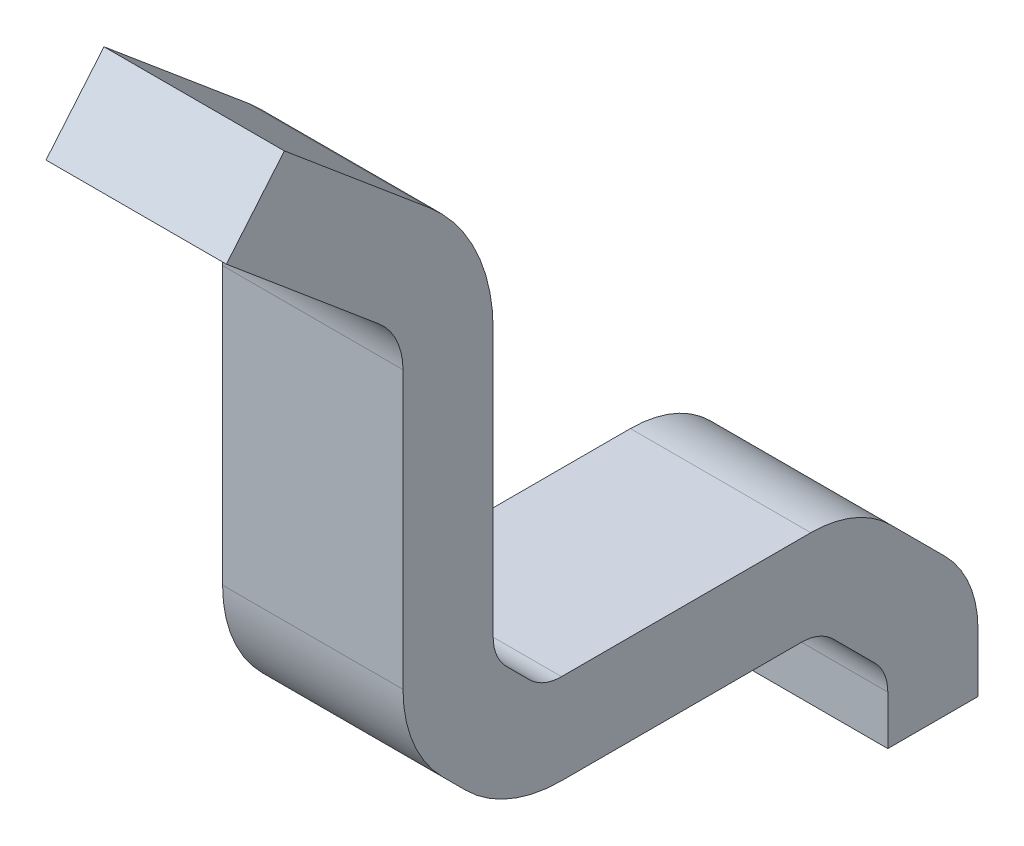
ISO-10303-21;
HEADER;
FILE_DESCRIPTION(('STEP AP214'),'2;1');
FILE_NAME('part.step','',(''),(''),'','','');
FILE_SCHEMA(('AUTOMOTIVE_DESIGN { 1 0 10303 214 1 1 1 1 }'));
ENDSEC;
DATA;
#1=APPLICATION_CONTEXT('core data for automotive mechanical design processes');
#2=APPLICATION_PROTOCOL_DEFINITION('international standard','automotive_design',2000,#1);
#3=PRODUCT_CONTEXT('',#1,'mechanical');
#4=PRODUCT('Part','Part','',(#3));
#5=PRODUCT_RELATED_PRODUCT_CATEGORY('part','',(#4));
#6=PRODUCT_DEFINITION_FORMATION('','',#4);
#7=PRODUCT_DEFINITION_CONTEXT('part definition',#1,'design');
#8=PRODUCT_DEFINITION('design','',#6,#7);
#9=PRODUCT_DEFINITION_SHAPE('','',#8);
#10=(LENGTH_UNIT() NAMED_UNIT(*) SI_UNIT(.MILLI.,.METRE.));
#11=(NAMED_UNIT(*) PLANE_ANGLE_UNIT() SI_UNIT($,.RADIAN.));
#12=(NAMED_UNIT(*) SI_UNIT($,.STERADIAN.) SOLID_ANGLE_UNIT());
#13=UNCERTAINTY_MEASURE_WITH_UNIT(LENGTH_MEASURE(1.E-05),#10,'distance_accuracy_value','');
#14=(GEOMETRIC_REPRESENTATION_CONTEXT(3) GLOBAL_UNCERTAINTY_ASSIGNED_CONTEXT((#13)) GLOBAL_UNIT_ASSIGNED_CONTEXT((#10,
#11,#12)) REPRESENTATION_CONTEXT('',''));
#15=CARTESIAN_POINT('',(0.,0.,0.));
#16=DIRECTION('',(0.,0.,1.));
#17=DIRECTION('',(1.,0.,0.));
#18=AXIS2_PLACEMENT_3D('',#15,#16,#17);
#19=CARTESIAN_POINT('',(0.,-39.82481453965,-663.1));
#20=DIRECTION('',(0.,0.707106781186598,-0.707106781186498));
#21=DIRECTION('',(0.,0.707106781186498,0.707106781186598));
#22=AXIS2_PLACEMENT_3D('',#19,#20,#21);
#23=PLANE('',#22);
#24=DIRECTION('',(0.,0.707106781186498,0.707106781186598));
#25=VECTOR('',#24,1.);
#26=CARTESIAN_POINT('',(-4.,-39.82481453965,-663.1));
#27=LINE('',#26,#25);
#28=CARTESIAN_POINT('',(-4.,-40.3390281020291,-663.614213562356));
#29=VERTEX_POINT('',#28);
#30=CARTESIAN_POINT('',(-4.,-39.3106009772691,-662.585786437621));
#31=VERTEX_POINT('',#30);
#32=EDGE_CURVE('E401',#29,#31,#27,.T.);
#33=ORIENTED_EDGE('',*,*,#32,.T.);
#34=DIRECTION('',(1.,0.,0.));
#35=VECTOR('',#34,1.);
#36=CARTESIAN_POINT('',(-14.4288,-39.310600977263,-662.585786437617));
#37=LINE('',#36,#35);
#38=CARTESIAN_POINT('',(4.,-39.3106009772691,-662.585786437621));
#39=VERTEX_POINT('',#38);
#40=EDGE_CURVE('E402',#31,#39,#37,.T.);
#41=ORIENTED_EDGE('',*,*,#40,.T.);
#42=DIRECTION('',(0.,0.707106781186498,0.707106781186598));
#43=VECTOR('',#42,1.);
#44=CARTESIAN_POINT('',(4.,-39.82481453965,-663.1));
#45=LINE('',#44,#43);
#46=CARTESIAN_POINT('',(4.,-40.3390281020291,-663.614213562356));
#47=VERTEX_POINT('',#46);
#48=EDGE_CURVE('E413',#39,#47,#45,.F.);
#49=ORIENTED_EDGE('',*,*,#48,.T.);
#50=DIRECTION('',(-1.,0.,0.));
#51=VECTOR('',#50,1.);
#52=CARTESIAN_POINT('',(14.4288,-40.3390281020581,-663.614213562362));
#53=LINE('',#52,#51);
#54=EDGE_CURVE('E406',#47,#29,#53,.T.);
#55=ORIENTED_EDGE('',*,*,#54,.T.);
#56=EDGE_LOOP('',(#33,#41,#49,#55));
#57=FACE_BOUND('',#56,.T.);
#58=ADVANCED_FACE('F17',(#57),#23,.T.);
#59=CARTESIAN_POINT('',(0.,-42.6532416644,-660.2715728753));
#60=DIRECTION('',(0.,0.707106781186598,-0.707106781186498));
#61=DIRECTION('',(0.,0.707106781186498,0.707106781186598));
#62=AXIS2_PLACEMENT_3D('',#59,#60,#61);
#63=PLANE('',#62);
#64=DIRECTION('',(-1.,0.,0.));
#65=VECTOR('',#64,1.);
#66=CARTESIAN_POINT('',(14.4288,-43.1674552267793,-660.785786437591));
#67=LINE('',#66,#65);
#68=CARTESIAN_POINT('',(4.,-43.1674552267523,-660.785786437608));
#69=VERTEX_POINT('',#68);
#70=CARTESIAN_POINT('',(-4.,-43.167455226718,-660.785786437539));
#71=VERTEX_POINT('',#70);
#72=EDGE_CURVE('E342',#69,#71,#67,.T.);
#73=ORIENTED_EDGE('',*,*,#72,.F.);
#74=DIRECTION('',(0.,0.707106781186498,0.707106781186598));
#75=VECTOR('',#74,1.);
#76=CARTESIAN_POINT('',(4.,-42.6532416644,-660.2715728753));
#77=LINE('',#76,#75);
#78=CARTESIAN_POINT('',(4.,-42.1390281020148,-659.757359312895));
#79=VERTEX_POINT('',#78);
#80=EDGE_CURVE('E213',#79,#69,#77,.F.);
#81=ORIENTED_EDGE('',*,*,#80,.F.);
#82=DIRECTION('',(1.,0.,0.));
#83=VECTOR('',#82,1.);
#84=CARTESIAN_POINT('',(-14.4288,-42.1390281020293,-659.757359312891));
#85=LINE('',#84,#83);
#86=CARTESIAN_POINT('',(-4.,-42.139028101968,-659.757359312839));
#87=VERTEX_POINT('',#86);
#88=EDGE_CURVE('E346',#87,#79,#85,.T.);
#89=ORIENTED_EDGE('',*,*,#88,.F.);
#90=DIRECTION('',(0.,-0.707106781203749,-0.707106781169346));
#91=VECTOR('',#90,1.);
#92=CARTESIAN_POINT('',(-4.,-42.13902810202,-659.7573593129));
#93=LINE('',#92,#91);
#94=EDGE_CURVE('E354',#87,#71,#93,.T.);
#95=ORIENTED_EDGE('',*,*,#94,.T.);
#96=EDGE_LOOP('',(#73,#81,#89,#95));
#97=FACE_BOUND('',#96,.T.);
#98=ADVANCED_FACE('F766',(#97),#63,.F.);
#99=CARTESIAN_POINT('',(14.4288,-46.92481453965,-675.6715728753));
#100=DIRECTION('',(-1.,0.,0.));
#101=DIRECTION('',(0.,0.,1.));
#102=AXIS2_PLACEMENT_3D('',#99,#100,#101);
#103=CYLINDRICAL_SURFACE('',#102,2.);
#104=DIRECTION('',(1.,0.,0.));
#105=VECTOR('',#104,1.);
#106=CARTESIAN_POINT('',(0.,-45.5106009772649,-677.085786437615));
#107=LINE('',#106,#105);
#108=CARTESIAN_POINT('',(4.,-45.5106009772783,-677.085786437613));
#109=VERTEX_POINT('',#108);
#110=CARTESIAN_POINT('',(-4.,-45.5106009772825,-677.085786437632));
#111=VERTEX_POINT('',#110);
#112=EDGE_CURVE('E215',#109,#111,#107,.F.);
#113=ORIENTED_EDGE('',*,*,#112,.F.);
#114=CARTESIAN_POINT('',(4.,-46.92481453965,-675.6715728753));
#115=DIRECTION('',(-1.,0.,0.));
#116=DIRECTION('',(0.,0.,1.));
#117=AXIS2_PLACEMENT_3D('',#114,#115,#116);
#118=CIRCLE('',#117,2.);
#119=CARTESIAN_POINT('',(4.,-44.92481453965,-675.6715728753));
#120=VERTEX_POINT('',#119);
#121=EDGE_CURVE('E20',#120,#109,#118,.T.);
#122=ORIENTED_EDGE('',*,*,#121,.F.);
#123=DIRECTION('',(1.,0.,0.));
#124=VECTOR('',#123,1.);
#125=CARTESIAN_POINT('',(-4.,-44.92481453965,-675.6715728753));
#126=LINE('',#125,#124);
#127=CARTESIAN_POINT('',(-4.,-44.92481453965,-675.6715728753));
#128=VERTEX_POINT('',#127);
#129=EDGE_CURVE('E339',#128,#120,#126,.T.);
#130=ORIENTED_EDGE('',*,*,#129,.F.);
#131=CARTESIAN_POINT('',(-4.,-46.92481453965,-675.6715728753));
#132=DIRECTION('',(-1.,0.,0.));
#133=DIRECTION('',(0.,0.,1.));
#134=AXIS2_PLACEMENT_3D('',#131,#132,#133);
#135=CIRCLE('',#134,2.);
#136=EDGE_CURVE('E217',#128,#111,#135,.T.);
#137=ORIENTED_EDGE('',*,*,#136,.T.);
#138=EDGE_LOOP('',(#113,#122,#130,#137));
#139=FACE_BOUND('',#138,.T.);
#140=ADVANCED_FACE('F216',(#139),#103,.F.);
#141=CARTESIAN_POINT('',(-14.4288,-48.7532416644,-677.5));
#142=DIRECTION('',(1.,0.,0.));
#143=DIRECTION('',(0.,0.,-1.));
#144=AXIS2_PLACEMENT_3D('',#141,#142,#143);
#145=CYLINDRICAL_SURFACE('',#144,2.);
#146=DIRECTION('',(1.,0.,0.));
#147=VECTOR('',#146,1.);
#148=CARTESIAN_POINT('',(0.,-47.3390281020351,-678.914213562385));
#149=LINE('',#148,#147);
#150=CARTESIAN_POINT('',(-4.,-47.33902810203,-678.91421356238));
#151=VERTEX_POINT('',#150);
#152=CARTESIAN_POINT('',(4.,-47.3390281020109,-678.914213562376));
#153=VERTEX_POINT('',#152);
#154=EDGE_CURVE('E223',#151,#153,#149,.T.);
#155=ORIENTED_EDGE('',*,*,#154,.F.);
#156=CARTESIAN_POINT('',(-4.,-48.7532416644,-677.5));
#157=DIRECTION('',(1.,0.,0.));
#158=DIRECTION('',(0.,0.,-1.));
#159=AXIS2_PLACEMENT_3D('',#156,#157,#158);
#160=CIRCLE('',#159,2.);
#161=CARTESIAN_POINT('',(-4.,-48.7532416644,-679.5));
#162=VERTEX_POINT('',#161);
#163=EDGE_CURVE('E461',#151,#162,#160,.F.);
#164=ORIENTED_EDGE('',*,*,#163,.T.);
#165=DIRECTION('',(1.,0.,0.));
#166=VECTOR('',#165,1.);
#167=CARTESIAN_POINT('',(4.,-48.7532416644,-679.5));
#168=LINE('',#167,#166);
#169=CARTESIAN_POINT('',(4.,-48.7532416644,-679.5));
#170=VERTEX_POINT('',#169);
#171=EDGE_CURVE('E326',#170,#162,#168,.F.);
#172=ORIENTED_EDGE('',*,*,#171,.F.);
#173=CARTESIAN_POINT('',(4.,-48.7532416644,-677.5));
#174=DIRECTION('',(1.,0.,0.));
#175=DIRECTION('',(0.,0.,-1.));
#176=AXIS2_PLACEMENT_3D('',#173,#174,#175);
#177=CIRCLE('',#176,2.);
#178=EDGE_CURVE('E212',#153,#170,#177,.F.);
#179=ORIENTED_EDGE('',*,*,#178,.F.);
#180=EDGE_LOOP('',(#155,#164,#172,#179));
#181=FACE_BOUND('',#180,.T.);
#182=ADVANCED_FACE('F472',(#181),#145,.F.);
#183=CARTESIAN_POINT('',(14.4288,-38.92481453965,-665.0284271247));
#184=DIRECTION('',(-1.,0.,0.));
#185=DIRECTION('',(0.,0.,1.));
#186=AXIS2_PLACEMENT_3D('',#183,#184,#185);
#187=CYLINDRICAL_SURFACE('',#186,2.);
#188=ORIENTED_EDGE('',*,*,#54,.F.);
#189=CARTESIAN_POINT('',(4.,-38.92481453965,-665.0284271247));
#190=DIRECTION('',(-1.,0.,0.));
#191=DIRECTION('',(0.,0.,1.));
#192=AXIS2_PLACEMENT_3D('',#189,#190,#191);
#193=CIRCLE('',#192,2.);
#194=CARTESIAN_POINT('',(4.,-40.92481453965,-665.0284271247));
#195=VERTEX_POINT('',#194);
#196=EDGE_CURVE('E410',#195,#47,#193,.T.);
#197=ORIENTED_EDGE('',*,*,#196,.F.);
#198=DIRECTION('',(1.,0.,0.));
#199=VECTOR('',#198,1.);
#200=CARTESIAN_POINT('',(-4.,-40.92481453965,-665.0284271247));
#201=LINE('',#200,#199);
#202=CARTESIAN_POINT('',(-4.,-40.92481453965,-665.0284271247));
#203=VERTEX_POINT('',#202);
#204=EDGE_CURVE('E295',#203,#195,#201,.T.);
#205=ORIENTED_EDGE('',*,*,#204,.F.);
#206=CARTESIAN_POINT('',(-4.,-38.92481453965,-665.0284271247));
#207=DIRECTION('',(-1.,0.,0.));
#208=DIRECTION('',(0.,0.,1.));
#209=AXIS2_PLACEMENT_3D('',#206,#207,#208);
#210=CIRCLE('',#209,2.);
#211=EDGE_CURVE('E457',#203,#29,#210,.T.);
#212=ORIENTED_EDGE('',*,*,#211,.T.);
#213=EDGE_LOOP('',(#188,#197,#205,#212));
#214=FACE_BOUND('',#213,.T.);
#215=ADVANCED_FACE('F558',(#214),#187,.F.);
#216=CARTESIAN_POINT('',(-14.4288,-37.8963874149,-664.));
#217=DIRECTION('',(1.,0.,0.));
#218=DIRECTION('',(0.,0.,-1.));
#219=AXIS2_PLACEMENT_3D('',#216,#217,#218);
#220=CYLINDRICAL_SURFACE('',#219,2.);
#221=ORIENTED_EDGE('',*,*,#40,.F.);
#222=CARTESIAN_POINT('',(-4.,-37.8963874149,-664.));
#223=DIRECTION('',(1.,0.,0.));
#224=DIRECTION('',(0.,0.,-1.));
#225=AXIS2_PLACEMENT_3D('',#222,#223,#224);
#226=CIRCLE('',#225,2.);
#227=CARTESIAN_POINT('',(-4.,-37.8963874149,-662.));
#228=VERTEX_POINT('',#227);
#229=EDGE_CURVE('E454',#31,#228,#226,.F.);
#230=ORIENTED_EDGE('',*,*,#229,.T.);
#231=DIRECTION('',(-1.,0.,0.));
#232=VECTOR('',#231,1.);
#233=CARTESIAN_POINT('',(-4.,-37.8963874149,-662.));
#234=LINE('',#233,#232);
#235=CARTESIAN_POINT('',(4.,-37.8963874149,-662.));
#236=VERTEX_POINT('',#235);
#237=EDGE_CURVE('E287',#236,#228,#234,.T.);
#238=ORIENTED_EDGE('',*,*,#237,.F.);
#239=CARTESIAN_POINT('',(4.,-37.8963874149,-664.));
#240=DIRECTION('',(1.,0.,0.));
#241=DIRECTION('',(0.,0.,-1.));
#242=AXIS2_PLACEMENT_3D('',#239,#240,#241);
#243=CIRCLE('',#242,2.);
#244=EDGE_CURVE('E357',#39,#236,#243,.F.);
#245=ORIENTED_EDGE('',*,*,#244,.F.);
#246=EDGE_LOOP('',(#221,#230,#238,#245));
#247=FACE_BOUND('',#246,.T.);
#248=ADVANCED_FACE('F552',(#247),#220,.F.);
#249=CARTESIAN_POINT('',(-4.,0.,0.));
#250=DIRECTION('',(1.,0.,0.));
#251=DIRECTION('',(0.,0.,-1.));
#252=AXIS2_PLACEMENT_3D('',#249,#250,#251);
#253=PLANE('',#252);
#254=DIRECTION('',(0.,0.642787609686505,0.766044443119007));
#255=VECTOR('',#254,1.);
#256=CARTESIAN_POINT('',(-4.,-14.59012398591,-652.7405631775));
#257=LINE('',#256,#255);
#258=CARTESIAN_POINT('',(-4.,-19.9618197288778,-659.142300877505));
#259=VERTEX_POINT('',#258);
#260=CARTESIAN_POINT('',(-4.,-14.5901239858933,-652.74056317748));
#261=VERTEX_POINT('',#260);
#262=EDGE_CURVE('E280',#259,#261,#257,.T.);
#263=ORIENTED_EDGE('',*,*,#262,.F.);
#264=CARTESIAN_POINT('',(-4.,-26.09017527384,-654.));
#265=DIRECTION('',(-1.,0.,0.));
#266=DIRECTION('',(0.,0.,1.));
#267=AXIS2_PLACEMENT_3D('',#264,#265,#266);
#268=CIRCLE('',#267,8.);
#269=CARTESIAN_POINT('',(-4.,-26.09017527384,-662.));
#270=VERTEX_POINT('',#269);
#271=EDGE_CURVE('E285',#270,#259,#268,.F.);
#272=ORIENTED_EDGE('',*,*,#271,.F.);
#273=DIRECTION('',(0.,1.,0.));
#274=VECTOR('',#273,1.);
#275=CARTESIAN_POINT('',(-4.,-40.92481453965,-662.));
#276=LINE('',#275,#274);
#277=EDGE_CURVE('E286',#228,#270,#276,.T.);
#278=ORIENTED_EDGE('',*,*,#277,.F.);
#279=ORIENTED_EDGE('',*,*,#229,.F.);
#280=ORIENTED_EDGE('',*,*,#32,.F.);
#281=ORIENTED_EDGE('',*,*,#211,.F.);
#282=DIRECTION('',(0.,0.,1.));
#283=VECTOR('',#282,1.);
#284=CARTESIAN_POINT('',(-4.,-40.92481453965,-683.5));
#285=LINE('',#284,#283);
#286=CARTESIAN_POINT('',(-4.,-40.92481453965,-676.0857864376));
#287=VERTEX_POINT('',#286);
#288=EDGE_CURVE('E299',#287,#203,#285,.T.);
#289=ORIENTED_EDGE('',*,*,#288,.F.);
#290=CARTESIAN_POINT('',(-4.,-45.92481453965,-676.0857864376));
#291=DIRECTION('',(-1.,0.,0.));
#292=DIRECTION('',(0.,0.,1.));
#293=AXIS2_PLACEMENT_3D('',#290,#291,#292);
#294=CIRCLE('',#293,5.);
#295=CARTESIAN_POINT('',(-4.,-42.3892806337386,-679.621320343546));
#296=VERTEX_POINT('',#295);
#297=EDGE_CURVE('E303',#296,#287,#294,.F.);
#298=ORIENTED_EDGE('',*,*,#297,.F.);
#299=DIRECTION('',(0.,-0.707106781186548,-0.707106781186548));
#300=VECTOR('',#299,1.);
#301=CARTESIAN_POINT('',(-4.,-43.5963874149,-680.8284271247));
#302=LINE('',#301,#300);
#303=CARTESIAN_POINT('',(-4.,-44.8034941961025,-682.035533905903));
#304=VERTEX_POINT('',#303);
#305=EDGE_CURVE('E306',#296,#304,#302,.T.);
#306=ORIENTED_EDGE('',*,*,#305,.T.);
#307=CARTESIAN_POINT('',(-4.,-48.33902810202,-678.5));
#308=DIRECTION('',(1.,0.,0.));
#309=DIRECTION('',(0.,0.,-1.));
#310=AXIS2_PLACEMENT_3D('',#307,#308,#309);
#311=CIRCLE('',#310,5.);
#312=CARTESIAN_POINT('',(-4.,-48.33902810202,-683.5));
#313=VERTEX_POINT('',#312);
#314=EDGE_CURVE('E310',#313,#304,#311,.T.);
#315=ORIENTED_EDGE('',*,*,#314,.F.);
#316=DIRECTION('',(0.,1.,0.));
#317=VECTOR('',#316,1.);
#318=CARTESIAN_POINT('',(-4.,-44.92481453965,-683.5));
#319=LINE('',#318,#317);
#320=CARTESIAN_POINT('',(-4.,-50.92481453965,-683.5));
#321=VERTEX_POINT('',#320);
#322=EDGE_CURVE('E311',#321,#313,#319,.T.);
#323=ORIENTED_EDGE('',*,*,#322,.F.);
#324=DIRECTION('',(0.,0.,-1.));
#325=VECTOR('',#324,1.);
#326=CARTESIAN_POINT('',(-4.,-50.92481453965,0.));
#327=LINE('',#326,#325);
#328=CARTESIAN_POINT('',(-4.,-50.92481453965,-679.5));
#329=VERTEX_POINT('',#328);
#330=EDGE_CURVE('E315',#329,#321,#327,.T.);
#331=ORIENTED_EDGE('',*,*,#330,.F.);
#332=DIRECTION('',(0.,1.,0.));
#333=VECTOR('',#332,1.);
#334=CARTESIAN_POINT('',(-4.,-44.92481453965,-679.5));
#335=LINE('',#334,#333);
#336=EDGE_CURVE('E222',#162,#329,#335,.F.);
#337=ORIENTED_EDGE('',*,*,#336,.F.);
#338=ORIENTED_EDGE('',*,*,#163,.F.);
#339=DIRECTION('',(0.,-0.707106781186548,-0.707106781186548));
#340=VECTOR('',#339,1.);
#341=CARTESIAN_POINT('',(-4.,-46.42481453965,-678.));
#342=LINE('',#341,#340);
#343=EDGE_CURVE('E332',#111,#151,#342,.T.);
#344=ORIENTED_EDGE('',*,*,#343,.F.);
#345=ORIENTED_EDGE('',*,*,#136,.F.);
#346=DIRECTION('',(0.,0.,-1.));
#347=VECTOR('',#346,1.);
#348=CARTESIAN_POINT('',(-4.,-44.92481453965,-658.));
#349=LINE('',#348,#347);
#350=CARTESIAN_POINT('',(-4.,-44.92481453965,-665.0284271247));
#351=VERTEX_POINT('',#350);
#352=EDGE_CURVE('E337',#351,#128,#349,.T.);
#353=ORIENTED_EDGE('',*,*,#352,.F.);
#354=CARTESIAN_POINT('',(-4.,-38.92481453965,-665.0284271247));
#355=DIRECTION('',(-1.,0.,0.));
#356=DIRECTION('',(0.,0.,1.));
#357=AXIS2_PLACEMENT_3D('',#354,#355,#356);
#358=CIRCLE('',#357,6.);
#359=EDGE_CURVE('E338',#71,#351,#358,.F.);
#360=ORIENTED_EDGE('',*,*,#359,.F.);
#361=ORIENTED_EDGE('',*,*,#94,.F.);
#362=CARTESIAN_POINT('',(-4.,-37.8963874149,-664.));
#363=DIRECTION('',(1.,0.,0.));
#364=DIRECTION('',(0.,0.,-1.));
#365=AXIS2_PLACEMENT_3D('',#362,#363,#364);
#366=CIRCLE('',#365,6.);
#367=CARTESIAN_POINT('',(-4.,-37.8963874149,-658.));
#368=VERTEX_POINT('',#367);
#369=EDGE_CURVE('E350',#368,#87,#366,.T.);
#370=ORIENTED_EDGE('',*,*,#369,.F.);
#371=DIRECTION('',(0.,1.,0.));
#372=VECTOR('',#371,1.);
#373=CARTESIAN_POINT('',(-4.,-28.22494464122,-658.));
#374=LINE('',#373,#372);
#375=CARTESIAN_POINT('',(-4.,-25.62386761569,-658.));
#376=VERTEX_POINT('',#375);
#377=EDGE_CURVE('E249',#376,#368,#374,.F.);
#378=ORIENTED_EDGE('',*,*,#377,.F.);
#379=CARTESIAN_POINT('',(-4.,-25.62386761569,-655.));
#380=DIRECTION('',(1.,0.,0.));
#381=DIRECTION('',(0.,0.,-1.));
#382=AXIS2_PLACEMENT_3D('',#379,#380,#381);
#383=CIRCLE('',#382,3.);
#384=CARTESIAN_POINT('',(-4.,-23.3257342863409,-656.928362829072));
#385=VERTEX_POINT('',#384);
#386=EDGE_CURVE('E253',#376,#385,#383,.T.);
#387=ORIENTED_EDGE('',*,*,#386,.T.);
#388=DIRECTION('',(0.,-0.642787609686505,-0.766044443119007));
#389=VECTOR('',#388,1.);
#390=CARTESIAN_POINT('',(-4.,-24.22494464122,-658.));
#391=LINE('',#390,#389);
#392=CARTESIAN_POINT('',(-4.,-17.6543017583791,-650.169412738709));
#393=VERTEX_POINT('',#392);
#394=EDGE_CURVE('E258',#393,#385,#391,.T.);
#395=ORIENTED_EDGE('',*,*,#394,.F.);
#396=DIRECTION('',(0.,-0.766044443119007,0.642787609686505));
#397=VECTOR('',#396,1.);
#398=CARTESIAN_POINT('',(-4.,-17.65430175839,-650.1694127387));
#399=LINE('',#398,#397);
#400=EDGE_CURVE('E259',#261,#393,#399,.T.);
#401=ORIENTED_EDGE('',*,*,#400,.F.);
#402=EDGE_LOOP('',(#263,#272,#278,#279,#280,#281,#289,#298,#306,#315,#323,#331,#337,#338,#344,
#345,#353,#360,#361,#370,#378,#387,#395,#401));
#403=FACE_BOUND('',#402,.T.);
#404=ADVANCED_FACE('F493',(#403),#253,.F.);
#405=CARTESIAN_POINT('',(-14.4288,-37.8963874149,-664.));
#406=DIRECTION('',(1.,0.,0.));
#407=DIRECTION('',(0.,0.,-1.));
#408=AXIS2_PLACEMENT_3D('',#405,#406,#407);
#409=CYLINDRICAL_SURFACE('',#408,6.);
#410=ORIENTED_EDGE('',*,*,#88,.T.);
#411=CARTESIAN_POINT('',(4.,-37.8963874149,-664.));
#412=DIRECTION('',(1.,0.,0.));
#413=DIRECTION('',(0.,0.,-1.));
#414=AXIS2_PLACEMENT_3D('',#411,#412,#413);
#415=CIRCLE('',#414,6.);
#416=CARTESIAN_POINT('',(4.,-37.8963874149,-658.));
#417=VERTEX_POINT('',#416);
#418=EDGE_CURVE('E244',#417,#79,#415,.T.);
#419=ORIENTED_EDGE('',*,*,#418,.F.);
#420=DIRECTION('',(1.,0.,0.));
#421=VECTOR('',#420,1.);
#422=CARTESIAN_POINT('',(-4.,-37.8963874149,-658.));
#423=LINE('',#422,#421);
#424=EDGE_CURVE('E245',#368,#417,#423,.T.);
#425=ORIENTED_EDGE('',*,*,#424,.F.);
#426=ORIENTED_EDGE('',*,*,#369,.T.);
#427=EDGE_LOOP('',(#410,#419,#425,#426));
#428=FACE_BOUND('',#427,.T.);
#429=ADVANCED_FACE('F721',(#428),#409,.T.);
#430=CARTESIAN_POINT('',(14.4288,-38.92481453965,-665.0284271247));
#431=DIRECTION('',(-1.,0.,0.));
#432=DIRECTION('',(0.,0.,1.));
#433=AXIS2_PLACEMENT_3D('',#430,#431,#432);
#434=CYLINDRICAL_SURFACE('',#433,6.);
#435=ORIENTED_EDGE('',*,*,#72,.T.);
#436=ORIENTED_EDGE('',*,*,#359,.T.);
#437=DIRECTION('',(1.,0.,0.));
#438=VECTOR('',#437,1.);
#439=CARTESIAN_POINT('',(-4.,-44.92481453965,-665.0284271247));
#440=LINE('',#439,#438);
#441=CARTESIAN_POINT('',(4.,-44.92481453965,-665.0284271247));
#442=VERTEX_POINT('',#441);
#443=EDGE_CURVE('E333',#442,#351,#440,.F.);
#444=ORIENTED_EDGE('',*,*,#443,.F.);
#445=CARTESIAN_POINT('',(4.,-38.92481453965,-665.0284271247));
#446=DIRECTION('',(-1.,0.,0.));
#447=DIRECTION('',(0.,0.,1.));
#448=AXIS2_PLACEMENT_3D('',#445,#446,#447);
#449=CIRCLE('',#448,6.);
#450=EDGE_CURVE('E237',#69,#442,#449,.F.);
#451=ORIENTED_EDGE('',*,*,#450,.F.);
#452=EDGE_LOOP('',(#435,#436,#444,#451));
#453=FACE_BOUND('',#452,.T.);
#454=ADVANCED_FACE('F712',(#453),#434,.T.);
#455=CARTESIAN_POINT('',(-4.,-44.92481453965,-658.));
#456=DIRECTION('',(0.,-1.,0.));
#457=DIRECTION('',(0.,0.,-1.));
#458=AXIS2_PLACEMENT_3D('',#455,#456,#457);
#459=PLANE('',#458);
#460=ORIENTED_EDGE('',*,*,#352,.T.);
#461=ORIENTED_EDGE('',*,*,#129,.T.);
#462=DIRECTION('',(0.,0.,-1.));
#463=VECTOR('',#462,1.);
#464=CARTESIAN_POINT('',(4.,-44.92481453965,0.));
#465=LINE('',#464,#463);
#466=EDGE_CURVE('E210',#442,#120,#465,.T.);
#467=ORIENTED_EDGE('',*,*,#466,.F.);
#468=ORIENTED_EDGE('',*,*,#443,.T.);
#469=EDGE_LOOP('',(#460,#461,#467,#468));
#470=FACE_BOUND('',#469,.T.);
#471=ADVANCED_FACE('F704',(#470),#459,.T.);
#472=CARTESIAN_POINT('',(0.,-46.42481453965,-678.));
#473=DIRECTION('',(0.,-0.707106781186548,0.707106781186548));
#474=DIRECTION('',(0.,-0.707106781186548,-0.707106781186548));
#475=AXIS2_PLACEMENT_3D('',#472,#473,#474);
#476=PLANE('',#475);
#477=DIRECTION('',(0.,-0.70710678117492,-0.707106781198175));
#478=VECTOR('',#477,1.);
#479=CARTESIAN_POINT('',(4.,-45.51060097728,-677.0857864376));
#480=LINE('',#479,#478);
#481=EDGE_CURVE('E207',#109,#153,#480,.T.);
#482=ORIENTED_EDGE('',*,*,#481,.F.);
#483=ORIENTED_EDGE('',*,*,#112,.T.);
#484=ORIENTED_EDGE('',*,*,#343,.T.);
#485=ORIENTED_EDGE('',*,*,#154,.T.);
#486=EDGE_LOOP('',(#482,#483,#484,#485));
#487=FACE_BOUND('',#486,.T.);
#488=ADVANCED_FACE('F226',(#487),#476,.T.);
#489=CARTESIAN_POINT('',(4.,-44.92481453965,-679.5));
#490=DIRECTION('',(0.,0.,1.));
#491=DIRECTION('',(1.,0.,0.));
#492=AXIS2_PLACEMENT_3D('',#489,#490,#491);
#493=PLANE('',#492);
#494=DIRECTION('',(0.,1.,0.));
#495=VECTOR('',#494,1.);
#496=CARTESIAN_POINT('',(4.,0.,-679.5));
#497=LINE('',#496,#495);
#498=CARTESIAN_POINT('',(4.,-50.92481453965,-679.5));
#499=VERTEX_POINT('',#498);
#500=EDGE_CURVE('E229',#170,#499,#497,.F.);
#501=ORIENTED_EDGE('',*,*,#500,.F.);
#502=ORIENTED_EDGE('',*,*,#171,.T.);
#503=ORIENTED_EDGE('',*,*,#336,.T.);
#504=DIRECTION('',(1.,0.,0.));
#505=VECTOR('',#504,1.);
#506=CARTESIAN_POINT('',(-4.,-50.92481453965,-679.5));
#507=LINE('',#506,#505);
#508=EDGE_CURVE('E323',#499,#329,#507,.F.);
#509=ORIENTED_EDGE('',*,*,#508,.F.);
#510=EDGE_LOOP('',(#501,#502,#503,#509));
#511=FACE_BOUND('',#510,.T.);
#512=ADVANCED_FACE('F476',(#511),#493,.T.);
#513=CARTESIAN_POINT('',(-4.,-50.92481453965,0.));
#514=DIRECTION('',(0.,-1.,0.));
#515=DIRECTION('',(0.,0.,-1.));
#516=AXIS2_PLACEMENT_3D('',#513,#514,#515);
#517=PLANE('',#516);
#518=DIRECTION('',(-1.,0.,0.));
#519=VECTOR('',#518,1.);
#520=CARTESIAN_POINT('',(-4.,-50.92481453965,-683.5));
#521=LINE('',#520,#519);
#522=CARTESIAN_POINT('',(4.,-50.92481453965,-683.5));
#523=VERTEX_POINT('',#522);
#524=EDGE_CURVE('E312',#523,#321,#521,.T.);
#525=ORIENTED_EDGE('',*,*,#524,.F.);
#526=DIRECTION('',(0.,0.,-1.));
#527=VECTOR('',#526,1.);
#528=CARTESIAN_POINT('',(4.,-50.92481453965,0.));
#529=LINE('',#528,#527);
#530=EDGE_CURVE('E234',#499,#523,#529,.T.);
#531=ORIENTED_EDGE('',*,*,#530,.F.);
#532=ORIENTED_EDGE('',*,*,#508,.T.);
#533=ORIENTED_EDGE('',*,*,#330,.T.);
#534=EDGE_LOOP('',(#525,#531,#532,#533));
#535=FACE_BOUND('',#534,.T.);
#536=ADVANCED_FACE('F482',(#535),#517,.T.);
#537=CARTESIAN_POINT('',(-4.,-44.92481453965,-683.5));
#538=DIRECTION('',(0.,0.,-1.));
#539=DIRECTION('',(-1.,0.,0.));
#540=AXIS2_PLACEMENT_3D('',#537,#538,#539);
#541=PLANE('',#540);
#542=ORIENTED_EDGE('',*,*,#322,.T.);
#543=DIRECTION('',(1.,0.,0.));
#544=VECTOR('',#543,1.);
#545=CARTESIAN_POINT('',(-14.4288,-48.33902810202,-683.5));
#546=LINE('',#545,#544);
#547=CARTESIAN_POINT('',(4.,-48.33902810202,-683.5));
#548=VERTEX_POINT('',#547);
#549=EDGE_CURVE('E307',#548,#313,#546,.F.);
#550=ORIENTED_EDGE('',*,*,#549,.F.);
#551=DIRECTION('',(0.,1.,0.));
#552=VECTOR('',#551,1.);
#553=CARTESIAN_POINT('',(4.,0.,-683.5));
#554=LINE('',#553,#552);
#555=EDGE_CURVE('E320',#523,#548,#554,.T.);
#556=ORIENTED_EDGE('',*,*,#555,.F.);
#557=ORIENTED_EDGE('',*,*,#524,.T.);
#558=EDGE_LOOP('',(#542,#550,#556,#557));
#559=FACE_BOUND('',#558,.T.);
#560=ADVANCED_FACE('F495',(#559),#541,.T.);
#561=CARTESIAN_POINT('',(-14.4288,-48.33902810202,-678.5));
#562=DIRECTION('',(1.,0.,0.));
#563=DIRECTION('',(0.,0.,-1.));
#564=AXIS2_PLACEMENT_3D('',#561,#562,#563);
#565=CYLINDRICAL_SURFACE('',#564,5.);
#566=DIRECTION('',(1.,0.,0.));
#567=VECTOR('',#566,1.);
#568=CARTESIAN_POINT('',(0.,-44.803494196095,-682.035533905895));
#569=LINE('',#568,#567);
#570=CARTESIAN_POINT('',(4.,-44.8034941961256,-682.035533905931));
#571=VERTEX_POINT('',#570);
#572=EDGE_CURVE('E304',#304,#571,#569,.T.);
#573=ORIENTED_EDGE('',*,*,#572,.T.);
#574=CARTESIAN_POINT('',(4.,-48.33902810202,-678.5));
#575=DIRECTION('',(1.,0.,0.));
#576=DIRECTION('',(0.,0.,-1.));
#577=AXIS2_PLACEMENT_3D('',#574,#575,#576);
#578=CIRCLE('',#577,5.);
#579=EDGE_CURVE('E430',#548,#571,#578,.T.);
#580=ORIENTED_EDGE('',*,*,#579,.F.);
#581=ORIENTED_EDGE('',*,*,#549,.T.);
#582=ORIENTED_EDGE('',*,*,#314,.T.);
#583=EDGE_LOOP('',(#573,#580,#581,#582));
#584=FACE_BOUND('',#583,.T.);
#585=ADVANCED_FACE('F568',(#584),#565,.T.);
#586=CARTESIAN_POINT('',(0.,-43.5963874149,-680.8284271247));
#587=DIRECTION('',(0.,-0.707106781186548,0.707106781186548));
#588=DIRECTION('',(0.,-0.707106781186548,-0.707106781186548));
#589=AXIS2_PLACEMENT_3D('',#586,#587,#588);
#590=PLANE('',#589);
#591=ORIENTED_EDGE('',*,*,#572,.F.);
#592=ORIENTED_EDGE('',*,*,#305,.F.);
#593=DIRECTION('',(-1.,0.,0.));
#594=VECTOR('',#593,1.);
#595=CARTESIAN_POINT('',(14.4288,-42.3892806337523,-679.621320343568));
#596=LINE('',#595,#594);
#597=CARTESIAN_POINT('',(4.,-42.3892806337443,-679.621320343592));
#598=VERTEX_POINT('',#597);
#599=EDGE_CURVE('E300',#598,#296,#596,.T.);
#600=ORIENTED_EDGE('',*,*,#599,.F.);
#601=DIRECTION('',(0.,0.707106781196801,0.707106781176294));
#602=VECTOR('',#601,1.);
#603=CARTESIAN_POINT('',(4.,-44.80349419609,-682.0355339059));
#604=LINE('',#603,#602);
#605=EDGE_CURVE('E429',#571,#598,#604,.T.);
#606=ORIENTED_EDGE('',*,*,#605,.F.);
#607=EDGE_LOOP('',(#591,#592,#600,#606));
#608=FACE_BOUND('',#607,.T.);
#609=ADVANCED_FACE('F570',(#608),#590,.F.);
#610=CARTESIAN_POINT('',(14.4288,-45.92481453965,-676.0857864376));
#611=DIRECTION('',(-1.,0.,0.));
#612=DIRECTION('',(0.,0.,1.));
#613=AXIS2_PLACEMENT_3D('',#610,#611,#612);
#614=CYLINDRICAL_SURFACE('',#613,5.);
#615=ORIENTED_EDGE('',*,*,#599,.T.);
#616=ORIENTED_EDGE('',*,*,#297,.T.);
#617=DIRECTION('',(1.,0.,0.));
#618=VECTOR('',#617,1.);
#619=CARTESIAN_POINT('',(-4.,-40.92481453965,-676.0857864376));
#620=LINE('',#619,#618);
#621=CARTESIAN_POINT('',(4.,-40.92481453965,-676.0857864376));
#622=VERTEX_POINT('',#621);
#623=EDGE_CURVE('E291',#622,#287,#620,.F.);
#624=ORIENTED_EDGE('',*,*,#623,.F.);
#625=CARTESIAN_POINT('',(4.,-45.92481453965,-676.0857864376));
#626=DIRECTION('',(-1.,0.,0.));
#627=DIRECTION('',(0.,0.,1.));
#628=AXIS2_PLACEMENT_3D('',#625,#626,#627);
#629=CIRCLE('',#628,5.);
#630=EDGE_CURVE('E424',#598,#622,#629,.F.);
#631=ORIENTED_EDGE('',*,*,#630,.F.);
#632=EDGE_LOOP('',(#615,#616,#624,#631));
#633=FACE_BOUND('',#632,.T.);
#634=ADVANCED_FACE('F564',(#633),#614,.T.);
#635=CARTESIAN_POINT('',(-4.,-40.92481453965,-683.5));
#636=DIRECTION('',(0.,1.,0.));
#637=DIRECTION('',(0.,0.,1.));
#638=AXIS2_PLACEMENT_3D('',#635,#636,#637);
#639=PLANE('',#638);
#640=DIRECTION('',(0.,0.,-1.));
#641=VECTOR('',#640,1.);
#642=CARTESIAN_POINT('',(4.,-40.92481453965,0.));
#643=LINE('',#642,#641);
#644=EDGE_CURVE('E428',#622,#195,#643,.F.);
#645=ORIENTED_EDGE('',*,*,#644,.F.);
#646=ORIENTED_EDGE('',*,*,#623,.T.);
#647=ORIENTED_EDGE('',*,*,#288,.T.);
#648=ORIENTED_EDGE('',*,*,#204,.T.);
#649=EDGE_LOOP('',(#645,#646,#647,#648));
#650=FACE_BOUND('',#649,.T.);
#651=ADVANCED_FACE('F561',(#650),#639,.T.);
#652=CARTESIAN_POINT('',(-4.,-40.92481453965,-662.));
#653=DIRECTION('',(0.,0.,-1.));
#654=DIRECTION('',(-1.,0.,0.));
#655=AXIS2_PLACEMENT_3D('',#652,#653,#654);
#656=PLANE('',#655);
#657=ORIENTED_EDGE('',*,*,#277,.T.);
#658=DIRECTION('',(-1.,0.,0.));
#659=VECTOR('',#658,1.);
#660=CARTESIAN_POINT('',(14.4288,-26.09017527384,-662.));
#661=LINE('',#660,#659);
#662=CARTESIAN_POINT('',(4.,-26.09017527384,-662.));
#663=VERTEX_POINT('',#662);
#664=EDGE_CURVE('E281',#663,#270,#661,.T.);
#665=ORIENTED_EDGE('',*,*,#664,.F.);
#666=DIRECTION('',(0.,1.,0.));
#667=VECTOR('',#666,1.);
#668=CARTESIAN_POINT('',(4.,0.,-662.));
#669=LINE('',#668,#667);
#670=EDGE_CURVE('E423',#236,#663,#669,.T.);
#671=ORIENTED_EDGE('',*,*,#670,.F.);
#672=ORIENTED_EDGE('',*,*,#237,.T.);
#673=EDGE_LOOP('',(#657,#665,#671,#672));
#674=FACE_BOUND('',#673,.T.);
#675=ADVANCED_FACE('F548',(#674),#656,.T.);
#676=CARTESIAN_POINT('',(14.4288,-26.09017527384,-654.));
#677=DIRECTION('',(-1.,0.,0.));
#678=DIRECTION('',(0.,0.,1.));
#679=AXIS2_PLACEMENT_3D('',#676,#677,#678);
#680=CYLINDRICAL_SURFACE('',#679,8.);
#681=ORIENTED_EDGE('',*,*,#664,.T.);
#682=ORIENTED_EDGE('',*,*,#271,.T.);
#683=DIRECTION('',(1.,0.,0.));
#684=VECTOR('',#683,1.);
#685=CARTESIAN_POINT('',(-4.,-19.9618197288802,-659.142300877508));
#686=LINE('',#685,#684);
#687=CARTESIAN_POINT('',(4.,-19.9618197288867,-659.142300877506));
#688=VERTEX_POINT('',#687);
#689=EDGE_CURVE('E274',#688,#259,#686,.F.);
#690=ORIENTED_EDGE('',*,*,#689,.F.);
#691=CARTESIAN_POINT('',(4.,-26.09017527384,-654.));
#692=DIRECTION('',(-1.,0.,0.));
#693=DIRECTION('',(0.,0.,1.));
#694=AXIS2_PLACEMENT_3D('',#691,#692,#693);
#695=CIRCLE('',#694,8.);
#696=EDGE_CURVE('E419',#663,#688,#695,.F.);
#697=ORIENTED_EDGE('',*,*,#696,.F.);
#698=EDGE_LOOP('',(#681,#682,#690,#697));
#699=FACE_BOUND('',#698,.T.);
#700=ADVANCED_FACE('F543',(#699),#680,.T.);
#701=CARTESIAN_POINT('',(-4.,-14.59012398591,-652.7405631775));
#702=DIRECTION('',(0.,0.766044443119007,-0.642787609686505));
#703=DIRECTION('',(0.,0.642787609686505,0.766044443119007));
#704=AXIS2_PLACEMENT_3D('',#701,#702,#703);
#705=PLANE('',#704);
#706=DIRECTION('',(0.,0.642787609687687,0.766044443118015));
#707=VECTOR('',#706,1.);
#708=CARTESIAN_POINT('',(4.,-19.96181972889,-659.1423008775));
#709=LINE('',#708,#707);
#710=CARTESIAN_POINT('',(4.,-14.5901239859017,-652.74056317749));
#711=VERTEX_POINT('',#710);
#712=EDGE_CURVE('E267',#688,#711,#709,.T.);
#713=ORIENTED_EDGE('',*,*,#712,.F.);
#714=ORIENTED_EDGE('',*,*,#689,.T.);
#715=ORIENTED_EDGE('',*,*,#262,.T.);
#716=DIRECTION('',(1.,0.,0.));
#717=VECTOR('',#716,1.);
#718=CARTESIAN_POINT('',(-4.,-14.590123985885,-652.74056317747));
#719=LINE('',#718,#717);
#720=EDGE_CURVE('E270',#711,#261,#719,.F.);
#721=ORIENTED_EDGE('',*,*,#720,.F.);
#722=EDGE_LOOP('',(#713,#714,#715,#721));
#723=FACE_BOUND('',#722,.T.);
#724=ADVANCED_FACE('F537',(#723),#705,.T.);
#725=CARTESIAN_POINT('',(-4.,-17.65430175839,-650.1694127387));
#726=DIRECTION('',(0.,0.642787609686505,0.766044443119007));
#727=DIRECTION('',(0.,-0.766044443119007,0.642787609686505));
#728=AXIS2_PLACEMENT_3D('',#725,#726,#727);
#729=PLANE('',#728);
#730=ORIENTED_EDGE('',*,*,#720,.T.);
#731=ORIENTED_EDGE('',*,*,#400,.T.);
#732=DIRECTION('',(1.,0.,0.));
#733=VECTOR('',#732,1.);
#734=CARTESIAN_POINT('',(-4.,-17.6543017583737,-650.169412738714));
#735=LINE('',#734,#733);
#736=CARTESIAN_POINT('',(4.,-17.6543017583846,-650.169412738705));
#737=VERTEX_POINT('',#736);
#738=EDGE_CURVE('E254',#737,#393,#735,.F.);
#739=ORIENTED_EDGE('',*,*,#738,.F.);
#740=DIRECTION('',(0.,-0.766044443112763,0.642787609693946));
#741=VECTOR('',#740,1.);
#742=CARTESIAN_POINT('',(4.,-14.59012398591,-652.7405631775));
#743=LINE('',#742,#741);
#744=EDGE_CURVE('E262',#711,#737,#743,.T.);
#745=ORIENTED_EDGE('',*,*,#744,.F.);
#746=EDGE_LOOP('',(#730,#731,#739,#745));
#747=FACE_BOUND('',#746,.T.);
#748=ADVANCED_FACE('F539',(#747),#729,.T.);
#749=CARTESIAN_POINT('',(-4.,-24.22494464122,-658.));
#750=DIRECTION('',(0.,-0.766044443119007,0.642787609686505));
#751=DIRECTION('',(0.,-0.642787609686505,-0.766044443119007));
#752=AXIS2_PLACEMENT_3D('',#749,#750,#751);
#753=PLANE('',#752);
#754=ORIENTED_EDGE('',*,*,#394,.T.);
#755=DIRECTION('',(1.,0.,0.));
#756=VECTOR('',#755,1.);
#757=CARTESIAN_POINT('',(-14.4288,-23.3257342863517,-656.928362829082));
#758=LINE('',#757,#756);
#759=CARTESIAN_POINT('',(4.,-23.3257342863265,-656.928362829074));
#760=VERTEX_POINT('',#759);
#761=EDGE_CURVE('E250',#385,#760,#758,.T.);
#762=ORIENTED_EDGE('',*,*,#761,.T.);
#763=DIRECTION('',(0.,-0.642787609682526,-0.766044443122345));
#764=VECTOR('',#763,1.);
#765=CARTESIAN_POINT('',(4.,-17.65430175839,-650.1694127387));
#766=LINE('',#765,#764);
#767=EDGE_CURVE('E266',#737,#760,#766,.T.);
#768=ORIENTED_EDGE('',*,*,#767,.F.);
#769=ORIENTED_EDGE('',*,*,#738,.T.);
#770=EDGE_LOOP('',(#754,#762,#768,#769));
#771=FACE_BOUND('',#770,.T.);
#772=ADVANCED_FACE('F522',(#771),#753,.T.);
#773=CARTESIAN_POINT('',(-14.4288,-25.62386761569,-655.));
#774=DIRECTION('',(1.,0.,0.));
#775=DIRECTION('',(0.,0.,-1.));
#776=AXIS2_PLACEMENT_3D('',#773,#774,#775);
#777=CYLINDRICAL_SURFACE('',#776,3.);
#778=ORIENTED_EDGE('',*,*,#761,.F.);
#779=ORIENTED_EDGE('',*,*,#386,.F.);
#780=DIRECTION('',(1.,0.,0.));
#781=VECTOR('',#780,1.);
#782=CARTESIAN_POINT('',(-4.,-25.62386761569,-658.));
#783=LINE('',#782,#781);
#784=CARTESIAN_POINT('',(4.,-25.62386761569,-658.));
#785=VERTEX_POINT('',#784);
#786=EDGE_CURVE('E40',#785,#376,#783,.F.);
#787=ORIENTED_EDGE('',*,*,#786,.F.);
#788=CARTESIAN_POINT('',(4.,-25.62386761569,-655.));
#789=DIRECTION('',(1.,0.,0.));
#790=DIRECTION('',(0.,0.,-1.));
#791=AXIS2_PLACEMENT_3D('',#788,#789,#790);
#792=CIRCLE('',#791,3.);
#793=EDGE_CURVE('E27',#760,#785,#792,.F.);
#794=ORIENTED_EDGE('',*,*,#793,.F.);
#795=EDGE_LOOP('',(#778,#779,#787,#794));
#796=FACE_BOUND('',#795,.T.);
#797=ADVANCED_FACE('F586',(#796),#777,.F.);
#798=CARTESIAN_POINT('',(-4.,-28.22494464122,-658.));
#799=DIRECTION('',(0.,0.,1.));
#800=DIRECTION('',(1.,0.,0.));
#801=AXIS2_PLACEMENT_3D('',#798,#799,#800);
#802=PLANE('',#801);
#803=DIRECTION('',(0.,1.,0.));
#804=VECTOR('',#803,1.);
#805=CARTESIAN_POINT('',(4.,0.,-658.));
#806=LINE('',#805,#804);
#807=EDGE_CURVE('E11',#785,#417,#806,.F.);
#808=ORIENTED_EDGE('',*,*,#807,.F.);
#809=ORIENTED_EDGE('',*,*,#786,.T.);
#810=ORIENTED_EDGE('',*,*,#377,.T.);
#811=ORIENTED_EDGE('',*,*,#424,.T.);
#812=EDGE_LOOP('',(#808,#809,#810,#811));
#813=FACE_BOUND('',#812,.T.);
#814=ADVANCED_FACE('F581',(#813),#802,.T.);
#815=CARTESIAN_POINT('',(4.,0.,0.));
#816=DIRECTION('',(1.,0.,0.));
#817=DIRECTION('',(0.,0.,-1.));
#818=AXIS2_PLACEMENT_3D('',#815,#816,#817);
#819=PLANE('',#818);
#820=ORIENTED_EDGE('',*,*,#793,.T.);
#821=ORIENTED_EDGE('',*,*,#807,.T.);
#822=ORIENTED_EDGE('',*,*,#418,.T.);
#823=ORIENTED_EDGE('',*,*,#80,.T.);
#824=ORIENTED_EDGE('',*,*,#450,.T.);
#825=ORIENTED_EDGE('',*,*,#466,.T.);
#826=ORIENTED_EDGE('',*,*,#121,.T.);
#827=ORIENTED_EDGE('',*,*,#481,.T.);
#828=ORIENTED_EDGE('',*,*,#178,.T.);
#829=ORIENTED_EDGE('',*,*,#500,.T.);
#830=ORIENTED_EDGE('',*,*,#530,.T.);
#831=ORIENTED_EDGE('',*,*,#555,.T.);
#832=ORIENTED_EDGE('',*,*,#579,.T.);
#833=ORIENTED_EDGE('',*,*,#605,.T.);
#834=ORIENTED_EDGE('',*,*,#630,.T.);
#835=ORIENTED_EDGE('',*,*,#644,.T.);
#836=ORIENTED_EDGE('',*,*,#196,.T.);
#837=ORIENTED_EDGE('',*,*,#48,.F.);
#838=ORIENTED_EDGE('',*,*,#244,.T.);
#839=ORIENTED_EDGE('',*,*,#670,.T.);
#840=ORIENTED_EDGE('',*,*,#696,.T.);
#841=ORIENTED_EDGE('',*,*,#712,.T.);
#842=ORIENTED_EDGE('',*,*,#744,.T.);
#843=ORIENTED_EDGE('',*,*,#767,.T.);
#844=EDGE_LOOP('',(#820,#821,#822,#823,#824,#825,#826,#827,#828,#829,#830,#831,#832,#833,#834,
#835,#836,#837,#838,#839,#840,#841,#842,#843));
#845=FACE_BOUND('',#844,.T.);
#846=ADVANCED_FACE('F205',(#845),#819,.T.);
#847=CLOSED_SHELL('',(#58,#98,#140,#182,#215,#248,#404,#429,#454,#471,#488,#512,#536,#560,#585,
#609,#634,#651,#675,#700,#724,#748,#772,#797,#814,#846));
#848=MANIFOLD_SOLID_BREP('B1',#847);
#849=ADVANCED_BREP_SHAPE_REPRESENTATION('',(#18,#848),#14);
#850=SHAPE_DEFINITION_REPRESENTATION(#9,#849);
ENDSEC;
END-ISO-10303-21;
